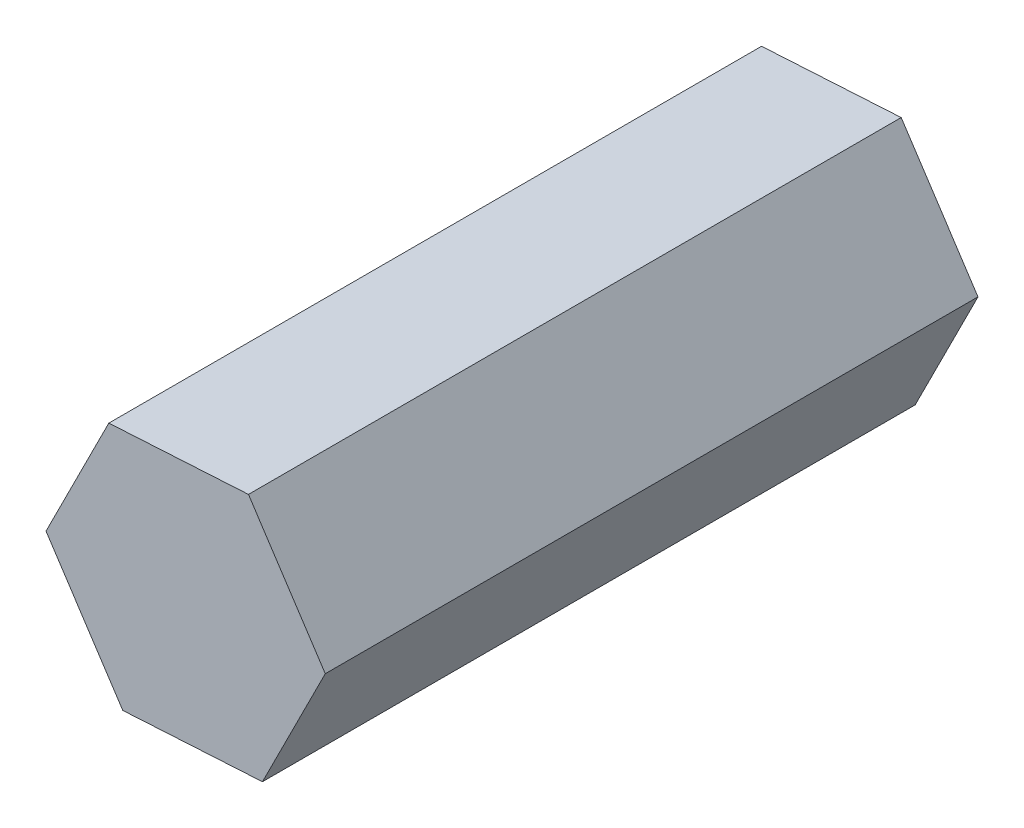
ISO-10303-21;
HEADER;
FILE_DESCRIPTION(('STEP AP214'),'2;1');
FILE_NAME('part.step','',(''),(''),'','','');
FILE_SCHEMA(('AUTOMOTIVE_DESIGN { 1 0 10303 214 1 1 1 1 }'));
ENDSEC;
DATA;
#1=APPLICATION_CONTEXT('core data for automotive mechanical design processes');
#2=APPLICATION_PROTOCOL_DEFINITION('international standard','automotive_design',2000,#1);
#3=PRODUCT_CONTEXT('',#1,'mechanical');
#4=PRODUCT('Part','Part','',(#3));
#5=PRODUCT_RELATED_PRODUCT_CATEGORY('part','',(#4));
#6=PRODUCT_DEFINITION_FORMATION('','',#4);
#7=PRODUCT_DEFINITION_CONTEXT('part definition',#1,'design');
#8=PRODUCT_DEFINITION('design','',#6,#7);
#9=PRODUCT_DEFINITION_SHAPE('','',#8);
#10=(LENGTH_UNIT() NAMED_UNIT(*) SI_UNIT(.MILLI.,.METRE.));
#11=(NAMED_UNIT(*) PLANE_ANGLE_UNIT() SI_UNIT($,.RADIAN.));
#12=(NAMED_UNIT(*) SI_UNIT($,.STERADIAN.) SOLID_ANGLE_UNIT());
#13=UNCERTAINTY_MEASURE_WITH_UNIT(LENGTH_MEASURE(1.E-05),#10,'distance_accuracy_value','');
#14=(GEOMETRIC_REPRESENTATION_CONTEXT(3) GLOBAL_UNCERTAINTY_ASSIGNED_CONTEXT((#13)) GLOBAL_UNIT_ASSIGNED_CONTEXT((#10,
#11,#12)) REPRESENTATION_CONTEXT('',''));
#15=CARTESIAN_POINT('',(0.,0.,0.));
#16=DIRECTION('',(0.,0.,1.));
#17=DIRECTION('',(1.,0.,0.));
#18=AXIS2_PLACEMENT_3D('',#15,#16,#17);
#19=CARTESIAN_POINT('',(2.99499572005856,0.17320691911962,14.));
#20=DIRECTION('',(-0.835712972745523,-0.549166484032702,0.));
#21=DIRECTION('',(0.549166484032702,-0.835712972745523,0.));
#22=AXIS2_PLACEMENT_3D('',#19,#20,#21);
#23=PLANE('',#22);
#24=DIRECTION('',(-0.549166484032702,0.835712972745523,0.));
#25=VECTOR('',#24,1.);
#26=CARTESIAN_POINT('',(2.99499572005856,0.17320691911962,0.));
#27=LINE('',#26,#25);
#28=CARTESIAN_POINT('',(2.99499572005856,0.17320691911962,0.));
#29=VERTEX_POINT('',#28);
#30=CARTESIAN_POINT('',(1.34749626796045,2.68034583735619,0.));
#31=VERTEX_POINT('',#30);
#32=EDGE_CURVE('E128',#29,#31,#27,.T.);
#33=ORIENTED_EDGE('',*,*,#32,.T.);
#34=DIRECTION('',(0.,0.,-1.));
#35=VECTOR('',#34,1.);
#36=CARTESIAN_POINT('',(1.34749626796045,2.68034583735619,14.));
#37=LINE('',#36,#35);
#38=CARTESIAN_POINT('',(1.34749626796045,2.68034583735619,14.));
#39=VERTEX_POINT('',#38);
#40=EDGE_CURVE('E11',#39,#31,#37,.T.);
#41=ORIENTED_EDGE('',*,*,#40,.F.);
#42=DIRECTION('',(-0.549166484032702,0.835712972745523,0.));
#43=VECTOR('',#42,1.);
#44=CARTESIAN_POINT('',(2.99499572005856,0.17320691911962,14.));
#45=LINE('',#44,#43);
#46=CARTESIAN_POINT('',(2.99499572005856,0.17320691911962,14.));
#47=VERTEX_POINT('',#46);
#48=EDGE_CURVE('E144',#47,#39,#45,.T.);
#49=ORIENTED_EDGE('',*,*,#48,.F.);
#50=DIRECTION('',(0.,0.,-1.));
#51=VECTOR('',#50,1.);
#52=CARTESIAN_POINT('',(2.99499572005856,0.17320691911962,14.));
#53=LINE('',#52,#51);
#54=EDGE_CURVE('E124',#47,#29,#53,.T.);
#55=ORIENTED_EDGE('',*,*,#54,.T.);
#56=EDGE_LOOP('',(#33,#41,#49,#55));
#57=FACE_BOUND('',#56,.T.);
#58=ADVANCED_FACE('F39',(#57),#23,.F.);
#59=CARTESIAN_POINT('',(1.34749626796045,2.68034583735619,14.));
#60=DIRECTION('',(0.0577356397065398,-0.998331906686186,0.));
#61=DIRECTION('',(0.998331906686187,0.0577356397065398,0.));
#62=AXIS2_PLACEMENT_3D('',#59,#60,#61);
#63=PLANE('',#62);
#64=DIRECTION('',(-0.998331906686186,-0.0577356397065398,0.));
#65=VECTOR('',#64,1.);
#66=CARTESIAN_POINT('',(1.34749626796045,2.68034583735619,0.));
#67=LINE('',#66,#65);
#68=CARTESIAN_POINT('',(-1.64749945209811,2.50713891823657,0.));
#69=VERTEX_POINT('',#68);
#70=EDGE_CURVE('E132',#31,#69,#67,.T.);
#71=ORIENTED_EDGE('',*,*,#70,.T.);
#72=DIRECTION('',(0.,0.,-1.));
#73=VECTOR('',#72,1.);
#74=CARTESIAN_POINT('',(-1.64749945209811,2.50713891823657,14.));
#75=LINE('',#74,#73);
#76=CARTESIAN_POINT('',(-1.64749945209811,2.50713891823657,14.));
#77=VERTEX_POINT('',#76);
#78=EDGE_CURVE('E48',#77,#69,#75,.T.);
#79=ORIENTED_EDGE('',*,*,#78,.F.);
#80=DIRECTION('',(-0.998331906686186,-0.0577356397065398,0.));
#81=VECTOR('',#80,1.);
#82=CARTESIAN_POINT('',(1.34749626796045,2.68034583735619,14.));
#83=LINE('',#82,#81);
#84=EDGE_CURVE('E93',#39,#77,#83,.T.);
#85=ORIENTED_EDGE('',*,*,#84,.F.);
#86=ORIENTED_EDGE('',*,*,#40,.T.);
#87=EDGE_LOOP('',(#71,#79,#85,#86));
#88=FACE_BOUND('',#87,.T.);
#89=ADVANCED_FACE('F172',(#88),#63,.F.);
#90=CARTESIAN_POINT('',(-1.64749945209811,2.50713891823657,14.));
#91=DIRECTION('',(0.893448612452063,-0.449165422653484,0.));
#92=DIRECTION('',(0.449165422653484,0.893448612452063,0.));
#93=AXIS2_PLACEMENT_3D('',#90,#91,#92);
#94=PLANE('',#93);
#95=DIRECTION('',(-0.449165422653484,-0.893448612452063,0.));
#96=VECTOR('',#95,1.);
#97=CARTESIAN_POINT('',(-1.64749945209811,2.50713891823657,0.));
#98=LINE('',#97,#96);
#99=CARTESIAN_POINT('',(-2.99499572005856,-0.173206919119621,0.));
#100=VERTEX_POINT('',#99);
#101=EDGE_CURVE('E135',#69,#100,#98,.T.);
#102=ORIENTED_EDGE('',*,*,#101,.T.);
#103=DIRECTION('',(0.,0.,-1.));
#104=VECTOR('',#103,1.);
#105=CARTESIAN_POINT('',(-2.99499572005856,-0.173206919119621,14.));
#106=LINE('',#105,#104);
#107=CARTESIAN_POINT('',(-2.99499572005856,-0.173206919119621,14.));
#108=VERTEX_POINT('',#107);
#109=EDGE_CURVE('E117',#108,#100,#106,.T.);
#110=ORIENTED_EDGE('',*,*,#109,.F.);
#111=DIRECTION('',(-0.449165422653484,-0.893448612452063,0.));
#112=VECTOR('',#111,1.);
#113=CARTESIAN_POINT('',(-1.64749945209811,2.50713891823657,14.));
#114=LINE('',#113,#112);
#115=EDGE_CURVE('E106',#77,#108,#114,.T.);
#116=ORIENTED_EDGE('',*,*,#115,.F.);
#117=ORIENTED_EDGE('',*,*,#78,.T.);
#118=EDGE_LOOP('',(#102,#110,#116,#117));
#119=FACE_BOUND('',#118,.T.);
#120=ADVANCED_FACE('F154',(#119),#94,.F.);
#121=CARTESIAN_POINT('',(-2.99499572005856,-0.173206919119621,14.));
#122=DIRECTION('',(0.835712972745523,0.549166484032702,0.));
#123=DIRECTION('',(-0.549166484032702,0.835712972745523,0.));
#124=AXIS2_PLACEMENT_3D('',#121,#122,#123);
#125=PLANE('',#124);
#126=DIRECTION('',(0.549166484032702,-0.835712972745523,0.));
#127=VECTOR('',#126,1.);
#128=CARTESIAN_POINT('',(-2.99499572005856,-0.173206919119621,0.));
#129=LINE('',#128,#127);
#130=CARTESIAN_POINT('',(-1.34749626796045,-2.68034583735619,0.));
#131=VERTEX_POINT('',#130);
#132=EDGE_CURVE('E115',#100,#131,#129,.T.);
#133=ORIENTED_EDGE('',*,*,#132,.T.);
#134=DIRECTION('',(0.,0.,-1.));
#135=VECTOR('',#134,1.);
#136=CARTESIAN_POINT('',(-1.34749626796045,-2.68034583735619,14.));
#137=LINE('',#136,#135);
#138=CARTESIAN_POINT('',(-1.34749626796045,-2.68034583735619,14.));
#139=VERTEX_POINT('',#138);
#140=EDGE_CURVE('E112',#139,#131,#137,.T.);
#141=ORIENTED_EDGE('',*,*,#140,.F.);
#142=DIRECTION('',(0.549166484032702,-0.835712972745523,0.));
#143=VECTOR('',#142,1.);
#144=CARTESIAN_POINT('',(-2.99499572005856,-0.173206919119621,14.));
#145=LINE('',#144,#143);
#146=EDGE_CURVE('E100',#108,#139,#145,.T.);
#147=ORIENTED_EDGE('',*,*,#146,.F.);
#148=ORIENTED_EDGE('',*,*,#109,.T.);
#149=EDGE_LOOP('',(#133,#141,#147,#148));
#150=FACE_BOUND('',#149,.T.);
#151=ADVANCED_FACE('F113',(#150),#125,.F.);
#152=CARTESIAN_POINT('',(-1.34749626796045,-2.68034583735619,14.));
#153=DIRECTION('',(-0.0577356397065393,0.998331906686186,0.));
#154=DIRECTION('',(-0.998331906686187,-0.0577356397065394,0.));
#155=AXIS2_PLACEMENT_3D('',#152,#153,#154);
#156=PLANE('',#155);
#157=DIRECTION('',(0.998331906686186,0.0577356397065393,0.));
#158=VECTOR('',#157,1.);
#159=CARTESIAN_POINT('',(-1.34749626796045,-2.68034583735619,0.));
#160=LINE('',#159,#158);
#161=CARTESIAN_POINT('',(1.64749945209811,-2.50713891823657,0.));
#162=VERTEX_POINT('',#161);
#163=EDGE_CURVE('E79',#131,#162,#160,.T.);
#164=ORIENTED_EDGE('',*,*,#163,.T.);
#165=DIRECTION('',(0.,0.,-1.));
#166=VECTOR('',#165,1.);
#167=CARTESIAN_POINT('',(1.64749945209811,-2.50713891823657,14.));
#168=LINE('',#167,#166);
#169=CARTESIAN_POINT('',(1.64749945209811,-2.50713891823657,14.));
#170=VERTEX_POINT('',#169);
#171=EDGE_CURVE('E118',#170,#162,#168,.T.);
#172=ORIENTED_EDGE('',*,*,#171,.F.);
#173=DIRECTION('',(0.998331906686186,0.0577356397065393,0.));
#174=VECTOR('',#173,1.);
#175=CARTESIAN_POINT('',(-1.34749626796045,-2.68034583735619,14.));
#176=LINE('',#175,#174);
#177=EDGE_CURVE('E104',#139,#170,#176,.T.);
#178=ORIENTED_EDGE('',*,*,#177,.F.);
#179=ORIENTED_EDGE('',*,*,#140,.T.);
#180=EDGE_LOOP('',(#164,#172,#178,#179));
#181=FACE_BOUND('',#180,.T.);
#182=ADVANCED_FACE('F120',(#181),#156,.F.);
#183=CARTESIAN_POINT('',(1.64749945209811,-2.50713891823657,14.));
#184=DIRECTION('',(-0.893448612452063,0.449165422653484,0.));
#185=DIRECTION('',(-0.449165422653484,-0.893448612452064,0.));
#186=AXIS2_PLACEMENT_3D('',#183,#184,#185);
#187=PLANE('',#186);
#188=DIRECTION('',(0.449165422653484,0.893448612452064,0.));
#189=VECTOR('',#188,1.);
#190=CARTESIAN_POINT('',(1.64749945209811,-2.50713891823657,0.));
#191=LINE('',#190,#189);
#192=EDGE_CURVE('E85',#162,#29,#191,.T.);
#193=ORIENTED_EDGE('',*,*,#192,.T.);
#194=ORIENTED_EDGE('',*,*,#54,.F.);
#195=DIRECTION('',(0.449165422653484,0.893448612452064,0.));
#196=VECTOR('',#195,1.);
#197=CARTESIAN_POINT('',(1.64749945209811,-2.50713891823657,14.));
#198=LINE('',#197,#196);
#199=EDGE_CURVE('E56',#170,#47,#198,.T.);
#200=ORIENTED_EDGE('',*,*,#199,.F.);
#201=ORIENTED_EDGE('',*,*,#171,.T.);
#202=EDGE_LOOP('',(#193,#194,#200,#201));
#203=FACE_BOUND('',#202,.T.);
#204=ADVANCED_FACE('F161',(#203),#187,.F.);
#205=CARTESIAN_POINT('',(0.,0.,14.));
#206=DIRECTION('',(0.,0.,1.));
#207=DIRECTION('',(1.,0.,0.));
#208=AXIS2_PLACEMENT_3D('',#205,#206,#207);
#209=PLANE('',#208);
#210=ORIENTED_EDGE('',*,*,#48,.T.);
#211=ORIENTED_EDGE('',*,*,#84,.T.);
#212=ORIENTED_EDGE('',*,*,#115,.T.);
#213=ORIENTED_EDGE('',*,*,#146,.T.);
#214=ORIENTED_EDGE('',*,*,#177,.T.);
#215=ORIENTED_EDGE('',*,*,#199,.T.);
#216=EDGE_LOOP('',(#210,#211,#212,#213,#214,#215));
#217=FACE_BOUND('',#216,.T.);
#218=ADVANCED_FACE('F102',(#217),#209,.T.);
#219=CARTESIAN_POINT('',(0.,0.,0.));
#220=DIRECTION('',(0.,0.,1.));
#221=DIRECTION('',(1.,0.,0.));
#222=AXIS2_PLACEMENT_3D('',#219,#220,#221);
#223=PLANE('',#222);
#224=ORIENTED_EDGE('',*,*,#32,.F.);
#225=ORIENTED_EDGE('',*,*,#192,.F.);
#226=ORIENTED_EDGE('',*,*,#163,.F.);
#227=ORIENTED_EDGE('',*,*,#132,.F.);
#228=ORIENTED_EDGE('',*,*,#101,.F.);
#229=ORIENTED_EDGE('',*,*,#70,.F.);
#230=EDGE_LOOP('',(#224,#225,#226,#227,#228,#229));
#231=FACE_BOUND('',#230,.T.);
#232=ADVANCED_FACE('F157',(#231),#223,.F.);
#233=CLOSED_SHELL('',(#58,#89,#120,#151,#182,#204,#218,#232));
#234=MANIFOLD_SOLID_BREP('B2',#233);
#235=ADVANCED_BREP_SHAPE_REPRESENTATION('',(#18,#234),#14);
#236=SHAPE_DEFINITION_REPRESENTATION(#9,#235);
ENDSEC;
END-ISO-10303-21;
